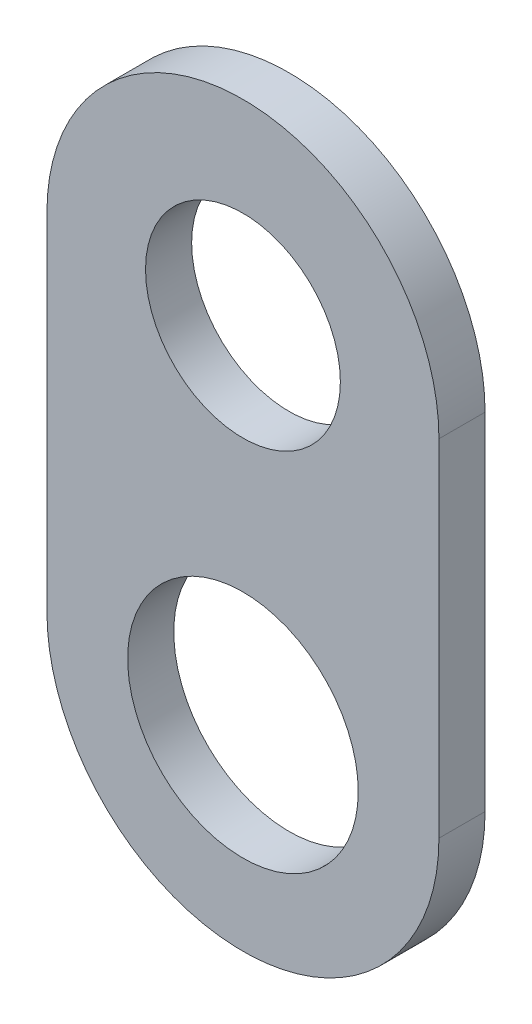
ISO-10303-21;
HEADER;
FILE_DESCRIPTION(('STEP AP214'),'2;1');
FILE_NAME('part.step','',(''),(''),'','','');
FILE_SCHEMA(('AUTOMOTIVE_DESIGN { 1 0 10303 214 1 1 1 1 }'));
ENDSEC;
DATA;
#1=APPLICATION_CONTEXT('core data for automotive mechanical design processes');
#2=APPLICATION_PROTOCOL_DEFINITION('international standard','automotive_design',2000,#1);
#3=PRODUCT_CONTEXT('',#1,'mechanical');
#4=PRODUCT('Part','Part','',(#3));
#5=PRODUCT_RELATED_PRODUCT_CATEGORY('part','',(#4));
#6=PRODUCT_DEFINITION_FORMATION('','',#4);
#7=PRODUCT_DEFINITION_CONTEXT('part definition',#1,'design');
#8=PRODUCT_DEFINITION('design','',#6,#7);
#9=PRODUCT_DEFINITION_SHAPE('','',#8);
#10=(LENGTH_UNIT() NAMED_UNIT(*) SI_UNIT(.MILLI.,.METRE.));
#11=(NAMED_UNIT(*) PLANE_ANGLE_UNIT() SI_UNIT($,.RADIAN.));
#12=(NAMED_UNIT(*) SI_UNIT($,.STERADIAN.) SOLID_ANGLE_UNIT());
#13=UNCERTAINTY_MEASURE_WITH_UNIT(LENGTH_MEASURE(1.E-05),#10,'distance_accuracy_value','');
#14=(GEOMETRIC_REPRESENTATION_CONTEXT(3) GLOBAL_UNCERTAINTY_ASSIGNED_CONTEXT((#13)) GLOBAL_UNIT_ASSIGNED_CONTEXT((#10,
#11,#12)) REPRESENTATION_CONTEXT('',''));
#15=CARTESIAN_POINT('',(0.,0.,0.));
#16=DIRECTION('',(0.,0.,1.));
#17=DIRECTION('',(1.,0.,0.));
#18=AXIS2_PLACEMENT_3D('',#15,#16,#17);
#19=CARTESIAN_POINT('',(0.,-38.1,5.08));
#20=DIRECTION('',(0.,0.,1.));
#21=DIRECTION('',(1.,0.,0.));
#22=AXIS2_PLACEMENT_3D('',#19,#20,#21);
#23=PLANE('',#22);
#24=CARTESIAN_POINT('',(0.,0.,5.08));
#25=DIRECTION('',(0.,0.,1.));
#26=DIRECTION('',(1.,0.,0.));
#27=AXIS2_PLACEMENT_3D('',#24,#25,#26);
#28=CIRCLE('',#27,10.7315);
#29=CARTESIAN_POINT('',(10.7315,0.,5.08));
#30=VERTEX_POINT('',#29);
#31=EDGE_CURVE('E115',#30,#30,#28,.T.);
#32=ORIENTED_EDGE('',*,*,#31,.F.);
#33=EDGE_LOOP('',(#32));
#34=FACE_BOUND('',#33,.T.);
#35=CARTESIAN_POINT('',(0.,-38.1,5.08));
#36=DIRECTION('',(0.,0.,1.));
#37=DIRECTION('',(1.,0.,0.));
#38=AXIS2_PLACEMENT_3D('',#35,#36,#37);
#39=CIRCLE('',#38,21.59);
#40=CARTESIAN_POINT('',(-21.59,-38.1,5.08));
#41=VERTEX_POINT('',#40);
#42=CARTESIAN_POINT('',(21.59,-38.1,5.08));
#43=VERTEX_POINT('',#42);
#44=EDGE_CURVE('E100',#41,#43,#39,.T.);
#45=ORIENTED_EDGE('',*,*,#44,.T.);
#46=DIRECTION('',(0.,1.,0.));
#47=VECTOR('',#46,1.);
#48=CARTESIAN_POINT('',(21.59,-38.1,5.08));
#49=LINE('',#48,#47);
#50=CARTESIAN_POINT('',(21.59,0.,5.08));
#51=VERTEX_POINT('',#50);
#52=EDGE_CURVE('E95',#43,#51,#49,.T.);
#53=ORIENTED_EDGE('',*,*,#52,.T.);
#54=CARTESIAN_POINT('',(0.,0.,5.08));
#55=DIRECTION('',(0.,0.,1.));
#56=DIRECTION('',(1.,0.,0.));
#57=AXIS2_PLACEMENT_3D('',#54,#55,#56);
#58=CIRCLE('',#57,21.59);
#59=CARTESIAN_POINT('',(-21.59,0.,5.08));
#60=VERTEX_POINT('',#59);
#61=EDGE_CURVE('E94',#51,#60,#58,.T.);
#62=ORIENTED_EDGE('',*,*,#61,.T.);
#63=DIRECTION('',(0.,-1.,0.));
#64=VECTOR('',#63,1.);
#65=CARTESIAN_POINT('',(-21.59,-38.1,5.08));
#66=LINE('',#65,#64);
#67=EDGE_CURVE('E64',#60,#41,#66,.T.);
#68=ORIENTED_EDGE('',*,*,#67,.T.);
#69=EDGE_LOOP('',(#45,#53,#62,#68));
#70=FACE_BOUND('',#69,.T.);
#71=CARTESIAN_POINT('',(0.,-38.1,5.08));
#72=DIRECTION('',(0.,0.,1.));
#73=DIRECTION('',(1.,0.,0.));
#74=AXIS2_PLACEMENT_3D('',#71,#72,#73);
#75=CIRCLE('',#74,12.7);
#76=CARTESIAN_POINT('',(12.7,-38.1,5.08));
#77=VERTEX_POINT('',#76);
#78=EDGE_CURVE('E130',#77,#77,#75,.T.);
#79=ORIENTED_EDGE('',*,*,#78,.F.);
#80=EDGE_LOOP('',(#79));
#81=FACE_BOUND('',#80,.T.);
#82=ADVANCED_FACE('F44',(#34,#70,#81),#23,.T.);
#83=CARTESIAN_POINT('',(0.,-38.1,0.));
#84=DIRECTION('',(0.,0.,1.));
#85=DIRECTION('',(1.,0.,0.));
#86=AXIS2_PLACEMENT_3D('',#83,#84,#85);
#87=PLANE('',#86);
#88=CARTESIAN_POINT('',(0.,-38.1,0.));
#89=DIRECTION('',(0.,0.,1.));
#90=DIRECTION('',(1.,0.,0.));
#91=AXIS2_PLACEMENT_3D('',#88,#89,#90);
#92=CIRCLE('',#91,21.59);
#93=CARTESIAN_POINT('',(-21.59,-38.1,0.));
#94=VERTEX_POINT('',#93);
#95=CARTESIAN_POINT('',(21.59,-38.1,0.));
#96=VERTEX_POINT('',#95);
#97=EDGE_CURVE('E110',#94,#96,#92,.T.);
#98=ORIENTED_EDGE('',*,*,#97,.F.);
#99=DIRECTION('',(0.,-1.,0.));
#100=VECTOR('',#99,1.);
#101=CARTESIAN_POINT('',(-21.59,-38.1,0.));
#102=LINE('',#101,#100);
#103=CARTESIAN_POINT('',(-21.59,0.,0.));
#104=VERTEX_POINT('',#103);
#105=EDGE_CURVE('E82',#104,#94,#102,.T.);
#106=ORIENTED_EDGE('',*,*,#105,.F.);
#107=CARTESIAN_POINT('',(0.,0.,0.));
#108=DIRECTION('',(0.,0.,1.));
#109=DIRECTION('',(1.,0.,0.));
#110=AXIS2_PLACEMENT_3D('',#107,#108,#109);
#111=CIRCLE('',#110,21.59);
#112=CARTESIAN_POINT('',(21.59,0.,0.));
#113=VERTEX_POINT('',#112);
#114=EDGE_CURVE('E80',#113,#104,#111,.T.);
#115=ORIENTED_EDGE('',*,*,#114,.F.);
#116=DIRECTION('',(0.,1.,0.));
#117=VECTOR('',#116,1.);
#118=CARTESIAN_POINT('',(21.59,-38.1,0.));
#119=LINE('',#118,#117);
#120=EDGE_CURVE('E102',#96,#113,#119,.T.);
#121=ORIENTED_EDGE('',*,*,#120,.F.);
#122=EDGE_LOOP('',(#98,#106,#115,#121));
#123=FACE_BOUND('',#122,.T.);
#124=CARTESIAN_POINT('',(0.,0.,0.));
#125=DIRECTION('',(0.,0.,1.));
#126=DIRECTION('',(1.,0.,0.));
#127=AXIS2_PLACEMENT_3D('',#124,#125,#126);
#128=CIRCLE('',#127,10.7315);
#129=CARTESIAN_POINT('',(10.7315,0.,0.));
#130=VERTEX_POINT('',#129);
#131=EDGE_CURVE('E125',#130,#130,#128,.T.);
#132=ORIENTED_EDGE('',*,*,#131,.T.);
#133=EDGE_LOOP('',(#132));
#134=FACE_BOUND('',#133,.T.);
#135=CARTESIAN_POINT('',(0.,-38.1,0.));
#136=DIRECTION('',(0.,0.,1.));
#137=DIRECTION('',(1.,0.,0.));
#138=AXIS2_PLACEMENT_3D('',#135,#136,#137);
#139=CIRCLE('',#138,12.7);
#140=CARTESIAN_POINT('',(12.7,-38.1,0.));
#141=VERTEX_POINT('',#140);
#142=EDGE_CURVE('E127',#141,#141,#139,.T.);
#143=ORIENTED_EDGE('',*,*,#142,.T.);
#144=EDGE_LOOP('',(#143));
#145=FACE_BOUND('',#144,.T.);
#146=ADVANCED_FACE('F116',(#123,#134,#145),#87,.F.);
#147=CARTESIAN_POINT('',(0.,-38.1,5.08));
#148=DIRECTION('',(0.,0.,-1.));
#149=DIRECTION('',(-1.,0.,0.));
#150=AXIS2_PLACEMENT_3D('',#147,#148,#149);
#151=CYLINDRICAL_SURFACE('',#150,21.59);
#152=ORIENTED_EDGE('',*,*,#97,.T.);
#153=DIRECTION('',(0.,0.,-1.));
#154=VECTOR('',#153,1.);
#155=CARTESIAN_POINT('',(21.59,-38.1,5.08));
#156=LINE('',#155,#154);
#157=EDGE_CURVE('E11',#43,#96,#156,.T.);
#158=ORIENTED_EDGE('',*,*,#157,.F.);
#159=ORIENTED_EDGE('',*,*,#44,.F.);
#160=DIRECTION('',(0.,0.,-1.));
#161=VECTOR('',#160,1.);
#162=CARTESIAN_POINT('',(-21.59,-38.1,5.08));
#163=LINE('',#162,#161);
#164=EDGE_CURVE('E103',#41,#94,#163,.T.);
#165=ORIENTED_EDGE('',*,*,#164,.T.);
#166=EDGE_LOOP('',(#152,#158,#159,#165));
#167=FACE_BOUND('',#166,.T.);
#168=ADVANCED_FACE('F50',(#167),#151,.T.);
#169=CARTESIAN_POINT('',(21.59,-38.1,5.08));
#170=DIRECTION('',(-1.,0.,0.));
#171=DIRECTION('',(0.,0.,1.));
#172=AXIS2_PLACEMENT_3D('',#169,#170,#171);
#173=PLANE('',#172);
#174=ORIENTED_EDGE('',*,*,#120,.T.);
#175=DIRECTION('',(0.,0.,-1.));
#176=VECTOR('',#175,1.);
#177=CARTESIAN_POINT('',(21.59,0.,5.08));
#178=LINE('',#177,#176);
#179=EDGE_CURVE('E53',#51,#113,#178,.T.);
#180=ORIENTED_EDGE('',*,*,#179,.F.);
#181=ORIENTED_EDGE('',*,*,#52,.F.);
#182=ORIENTED_EDGE('',*,*,#157,.T.);
#183=EDGE_LOOP('',(#174,#180,#181,#182));
#184=FACE_BOUND('',#183,.T.);
#185=ADVANCED_FACE('F99',(#184),#173,.F.);
#186=CARTESIAN_POINT('',(0.,0.,5.08));
#187=DIRECTION('',(0.,0.,-1.));
#188=DIRECTION('',(-1.,0.,0.));
#189=AXIS2_PLACEMENT_3D('',#186,#187,#188);
#190=CYLINDRICAL_SURFACE('',#189,21.59);
#191=ORIENTED_EDGE('',*,*,#114,.T.);
#192=DIRECTION('',(0.,0.,-1.));
#193=VECTOR('',#192,1.);
#194=CARTESIAN_POINT('',(-21.59,0.,5.08));
#195=LINE('',#194,#193);
#196=EDGE_CURVE('E105',#60,#104,#195,.T.);
#197=ORIENTED_EDGE('',*,*,#196,.F.);
#198=ORIENTED_EDGE('',*,*,#61,.F.);
#199=ORIENTED_EDGE('',*,*,#179,.T.);
#200=EDGE_LOOP('',(#191,#197,#198,#199));
#201=FACE_BOUND('',#200,.T.);
#202=ADVANCED_FACE('F104',(#201),#190,.T.);
#203=CARTESIAN_POINT('',(-21.59,-38.1,5.08));
#204=DIRECTION('',(1.,0.,0.));
#205=DIRECTION('',(0.,0.,-1.));
#206=AXIS2_PLACEMENT_3D('',#203,#204,#205);
#207=PLANE('',#206);
#208=ORIENTED_EDGE('',*,*,#105,.T.);
#209=ORIENTED_EDGE('',*,*,#164,.F.);
#210=ORIENTED_EDGE('',*,*,#67,.F.);
#211=ORIENTED_EDGE('',*,*,#196,.T.);
#212=EDGE_LOOP('',(#208,#209,#210,#211));
#213=FACE_BOUND('',#212,.T.);
#214=ADVANCED_FACE('F119',(#213),#207,.F.);
#215=CARTESIAN_POINT('',(0.,0.,5.08));
#216=DIRECTION('',(0.,0.,-1.));
#217=DIRECTION('',(-1.,0.,0.));
#218=AXIS2_PLACEMENT_3D('',#215,#216,#217);
#219=CYLINDRICAL_SURFACE('',#218,10.7315);
#220=ORIENTED_EDGE('',*,*,#31,.T.);
#221=EDGE_LOOP('',(#220));
#222=FACE_BOUND('',#221,.T.);
#223=ORIENTED_EDGE('',*,*,#131,.F.);
#224=EDGE_LOOP('',(#223));
#225=FACE_BOUND('',#224,.T.);
#226=ADVANCED_FACE('F150',(#222,#225),#219,.F.);
#227=CARTESIAN_POINT('',(0.,-38.1,5.08));
#228=DIRECTION('',(0.,0.,-1.));
#229=DIRECTION('',(-1.,0.,0.));
#230=AXIS2_PLACEMENT_3D('',#227,#228,#229);
#231=CYLINDRICAL_SURFACE('',#230,12.7);
#232=ORIENTED_EDGE('',*,*,#78,.T.);
#233=EDGE_LOOP('',(#232));
#234=FACE_BOUND('',#233,.T.);
#235=ORIENTED_EDGE('',*,*,#142,.F.);
#236=EDGE_LOOP('',(#235));
#237=FACE_BOUND('',#236,.T.);
#238=ADVANCED_FACE('F136',(#234,#237),#231,.F.);
#239=CLOSED_SHELL('',(#82,#146,#168,#185,#202,#214,#226,#238));
#240=MANIFOLD_SOLID_BREP('B2',#239);
#241=ADVANCED_BREP_SHAPE_REPRESENTATION('',(#18,#240),#14);
#242=SHAPE_DEFINITION_REPRESENTATION(#9,#241);
ENDSEC;
END-ISO-10303-21;
